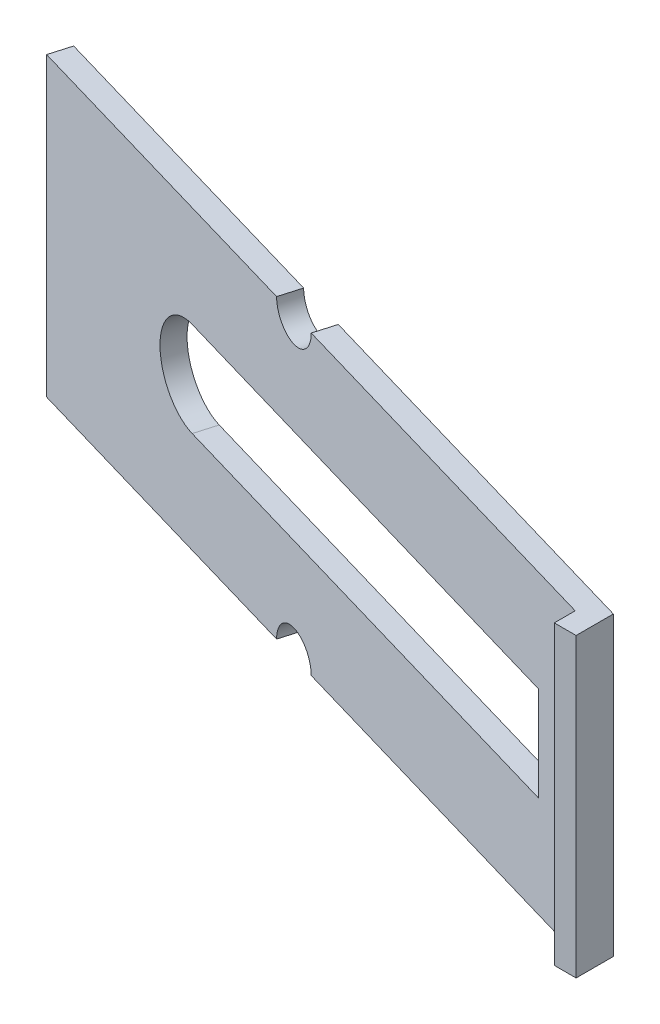
ISO-10303-21;
HEADER;
FILE_DESCRIPTION(('STEP AP214'),'2;1');
FILE_NAME('part.step','',(''),(''),'','','');
FILE_SCHEMA(('AUTOMOTIVE_DESIGN { 1 0 10303 214 1 1 1 1 }'));
ENDSEC;
DATA;
#1=APPLICATION_CONTEXT('core data for automotive mechanical design processes');
#2=APPLICATION_PROTOCOL_DEFINITION('international standard','automotive_design',2000,#1);
#3=PRODUCT_CONTEXT('',#1,'mechanical');
#4=PRODUCT('Part','Part','',(#3));
#5=PRODUCT_RELATED_PRODUCT_CATEGORY('part','',(#4));
#6=PRODUCT_DEFINITION_FORMATION('','',#4);
#7=PRODUCT_DEFINITION_CONTEXT('part definition',#1,'design');
#8=PRODUCT_DEFINITION('design','',#6,#7);
#9=PRODUCT_DEFINITION_SHAPE('','',#8);
#10=(LENGTH_UNIT() NAMED_UNIT(*) SI_UNIT(.MILLI.,.METRE.));
#11=(NAMED_UNIT(*) PLANE_ANGLE_UNIT() SI_UNIT($,.RADIAN.));
#12=(NAMED_UNIT(*) SI_UNIT($,.STERADIAN.) SOLID_ANGLE_UNIT());
#13=UNCERTAINTY_MEASURE_WITH_UNIT(LENGTH_MEASURE(1.E-05),#10,'distance_accuracy_value','');
#14=(GEOMETRIC_REPRESENTATION_CONTEXT(3) GLOBAL_UNCERTAINTY_ASSIGNED_CONTEXT((#13)) GLOBAL_UNIT_ASSIGNED_CONTEXT((#10,
#11,#12)) REPRESENTATION_CONTEXT('',''));
#15=CARTESIAN_POINT('',(0.,0.,0.));
#16=DIRECTION('',(0.,0.,1.));
#17=DIRECTION('',(1.,0.,0.));
#18=AXIS2_PLACEMENT_3D('',#15,#16,#17);
#19=CARTESIAN_POINT('',(0.,4.08,0.));
#20=DIRECTION('',(0.,1.,0.));
#21=DIRECTION('',(0.,0.,1.));
#22=AXIS2_PLACEMENT_3D('',#19,#20,#21);
#23=PLANE('',#22);
#24=DIRECTION('',(0.279829014030986,0.,-0.960049854385931));
#25=VECTOR('',#24,1.);
#26=CARTESIAN_POINT('',(-5.49324690261549,4.08,-1.02970279064248));
#27=LINE('',#26,#25);
#28=CARTESIAN_POINT('',(-5.27424605850798,4.08,-1.78106064831098));
#29=VERTEX_POINT('',#28);
#30=CARTESIAN_POINT('',(-5.19029735429868,4.08,-2.06907560462676));
#31=VERTEX_POINT('',#30);
#32=EDGE_CURVE('E145',#29,#31,#27,.T.);
#33=ORIENTED_EDGE('',*,*,#32,.F.);
#34=DIRECTION('',(0.96004985438593,0.,0.279829014030986));
#35=VECTOR('',#34,1.);
#36=CARTESIAN_POINT('',(-0.15,4.08,-0.287479126837171));
#37=LINE('',#36,#35);
#38=CARTESIAN_POINT('',(-0.15,4.08,-0.287479126837171));
#39=VERTEX_POINT('',#38);
#40=EDGE_CURVE('E174',#29,#39,#37,.T.);
#41=ORIENTED_EDGE('',*,*,#40,.T.);
#42=DIRECTION('',(0.,0.,1.));
#43=VECTOR('',#42,1.);
#44=CARTESIAN_POINT('',(-0.15,4.08,0.));
#45=LINE('',#44,#43);
#46=CARTESIAN_POINT('',(-0.15,4.08,0.));
#47=VERTEX_POINT('',#46);
#48=EDGE_CURVE('E183',#39,#47,#45,.T.);
#49=ORIENTED_EDGE('',*,*,#48,.T.);
#50=DIRECTION('',(1.,0.,0.));
#51=VECTOR('',#50,1.);
#52=CARTESIAN_POINT('',(-0.15,4.08,0.));
#53=LINE('',#52,#51);
#54=CARTESIAN_POINT('',(0.15,4.08,0.));
#55=VERTEX_POINT('',#54);
#56=EDGE_CURVE('E211',#47,#55,#53,.T.);
#57=ORIENTED_EDGE('',*,*,#56,.T.);
#58=DIRECTION('',(0.,0.,-1.));
#59=VECTOR('',#58,1.);
#60=CARTESIAN_POINT('',(0.15,4.08,0.));
#61=LINE('',#60,#59);
#62=CARTESIAN_POINT('',(0.15,4.08,-0.51252087316283));
#63=VERTEX_POINT('',#62);
#64=EDGE_CURVE('E167',#55,#63,#61,.T.);
#65=ORIENTED_EDGE('',*,*,#64,.T.);
#66=DIRECTION('',(-0.96004985438593,0.,-0.279829014030986));
#67=VECTOR('',#66,1.);
#68=CARTESIAN_POINT('',(0.15,4.08,-0.51252087316283));
#69=LINE('',#68,#67);
#70=EDGE_CURVE('E160',#63,#31,#69,.T.);
#71=ORIENTED_EDGE('',*,*,#70,.T.);
#72=EDGE_LOOP('',(#33,#41,#49,#57,#65,#71));
#73=FACE_BOUND('',#72,.T.);
#74=ADVANCED_FACE('F45',(#73),#23,.T.);
#75=CARTESIAN_POINT('',(0.,0.,0.));
#76=DIRECTION('',(0.,1.,0.));
#77=DIRECTION('',(0.,0.,1.));
#78=AXIS2_PLACEMENT_3D('',#75,#76,#77);
#79=PLANE('',#78);
#80=DIRECTION('',(0.96004985438593,0.,0.279829014030986));
#81=VECTOR('',#80,1.);
#82=CARTESIAN_POINT('',(-0.15,0.,-0.287479126837171));
#83=LINE('',#82,#81);
#84=CARTESIAN_POINT('',(-5.27424605850798,0.,-1.78106064831098));
#85=VERTEX_POINT('',#84);
#86=CARTESIAN_POINT('',(-0.15,0.,-0.287479126837171));
#87=VERTEX_POINT('',#86);
#88=EDGE_CURVE('E203',#85,#87,#83,.T.);
#89=ORIENTED_EDGE('',*,*,#88,.F.);
#90=DIRECTION('',(0.279829014030986,0.,-0.960049854385931));
#91=VECTOR('',#90,1.);
#92=CARTESIAN_POINT('',(-5.49324690261549,0.,-1.02970279064248));
#93=LINE('',#92,#91);
#94=CARTESIAN_POINT('',(-5.19029735429868,0.,-2.06907560462676));
#95=VERTEX_POINT('',#94);
#96=EDGE_CURVE('E235',#85,#95,#93,.T.);
#97=ORIENTED_EDGE('',*,*,#96,.T.);
#98=DIRECTION('',(-0.96004985438593,0.,-0.279829014030986));
#99=VECTOR('',#98,1.);
#100=CARTESIAN_POINT('',(0.15,0.,-0.51252087316283));
#101=LINE('',#100,#99);
#102=CARTESIAN_POINT('',(0.15,0.,-0.51252087316283));
#103=VERTEX_POINT('',#102);
#104=EDGE_CURVE('E196',#103,#95,#101,.T.);
#105=ORIENTED_EDGE('',*,*,#104,.F.);
#106=DIRECTION('',(0.,0.,-1.));
#107=VECTOR('',#106,1.);
#108=CARTESIAN_POINT('',(0.15,0.,0.));
#109=LINE('',#108,#107);
#110=CARTESIAN_POINT('',(0.15,0.,0.));
#111=VERTEX_POINT('',#110);
#112=EDGE_CURVE('E191',#111,#103,#109,.T.);
#113=ORIENTED_EDGE('',*,*,#112,.F.);
#114=DIRECTION('',(1.,0.,0.));
#115=VECTOR('',#114,1.);
#116=CARTESIAN_POINT('',(-0.15,0.,0.));
#117=LINE('',#116,#115);
#118=CARTESIAN_POINT('',(-0.15,0.,0.));
#119=VERTEX_POINT('',#118);
#120=EDGE_CURVE('E187',#119,#111,#117,.T.);
#121=ORIENTED_EDGE('',*,*,#120,.F.);
#122=DIRECTION('',(0.,0.,1.));
#123=VECTOR('',#122,1.);
#124=CARTESIAN_POINT('',(-0.15,0.,0.));
#125=LINE('',#124,#123);
#126=EDGE_CURVE('E208',#87,#119,#125,.T.);
#127=ORIENTED_EDGE('',*,*,#126,.F.);
#128=EDGE_LOOP('',(#89,#97,#105,#113,#121,#127));
#129=FACE_BOUND('',#128,.T.);
#130=ADVANCED_FACE('F233',(#129),#79,.F.);
#131=CARTESIAN_POINT('',(-0.15,4.08,0.));
#132=DIRECTION('',(0.,0.,-1.));
#133=DIRECTION('',(-1.,0.,0.));
#134=AXIS2_PLACEMENT_3D('',#131,#132,#133);
#135=PLANE('',#134);
#136=ORIENTED_EDGE('',*,*,#120,.T.);
#137=DIRECTION('',(0.,-1.,0.));
#138=VECTOR('',#137,1.);
#139=CARTESIAN_POINT('',(0.15,4.08,0.));
#140=LINE('',#139,#138);
#141=EDGE_CURVE('E11',#55,#111,#140,.T.);
#142=ORIENTED_EDGE('',*,*,#141,.F.);
#143=ORIENTED_EDGE('',*,*,#56,.F.);
#144=DIRECTION('',(0.,-1.,0.));
#145=VECTOR('',#144,1.);
#146=CARTESIAN_POINT('',(-0.15,4.08,0.));
#147=LINE('',#146,#145);
#148=EDGE_CURVE('E186',#47,#119,#147,.T.);
#149=ORIENTED_EDGE('',*,*,#148,.T.);
#150=EDGE_LOOP('',(#136,#142,#143,#149));
#151=FACE_BOUND('',#150,.T.);
#152=ADVANCED_FACE('F47',(#151),#135,.F.);
#153=CARTESIAN_POINT('',(0.15,4.08,0.));
#154=DIRECTION('',(-1.,0.,0.));
#155=DIRECTION('',(0.,0.,1.));
#156=AXIS2_PLACEMENT_3D('',#153,#154,#155);
#157=PLANE('',#156);
#158=ORIENTED_EDGE('',*,*,#112,.T.);
#159=DIRECTION('',(0.,-1.,0.));
#160=VECTOR('',#159,1.);
#161=CARTESIAN_POINT('',(0.15,4.08,-0.51252087316283));
#162=LINE('',#161,#160);
#163=EDGE_CURVE('E54',#63,#103,#162,.T.);
#164=ORIENTED_EDGE('',*,*,#163,.F.);
#165=ORIENTED_EDGE('',*,*,#64,.F.);
#166=ORIENTED_EDGE('',*,*,#141,.T.);
#167=EDGE_LOOP('',(#158,#164,#165,#166));
#168=FACE_BOUND('',#167,.T.);
#169=ADVANCED_FACE('F294',(#168),#157,.F.);
#170=CARTESIAN_POINT('',(0.15,4.08,-0.51252087316283));
#171=DIRECTION('',(-0.279829014030986,0.,0.96004985438593));
#172=DIRECTION('',(0.960049854385931,0.,0.279829014030986));
#173=AXIS2_PLACEMENT_3D('',#170,#171,#172);
#174=PLANE('',#173);
#175=DIRECTION('',(-0.96004985438593,0.,-0.279829014030986));
#176=VECTOR('',#175,1.);
#177=CARTESIAN_POINT('',(-0.781248358754352,1.39,-0.783955016772886));
#178=LINE('',#177,#176);
#179=CARTESIAN_POINT('',(-0.781248358754352,1.39,-0.783955016772886));
#180=VERTEX_POINT('',#179);
#181=CARTESIAN_POINT('',(-7.50159733945587,1.39,-2.74275811498979));
#182=VERTEX_POINT('',#181);
#183=EDGE_CURVE('E262',#180,#182,#178,.T.);
#184=ORIENTED_EDGE('',*,*,#183,.F.);
#185=DIRECTION('',(0.,-1.,0.));
#186=VECTOR('',#185,1.);
#187=CARTESIAN_POINT('',(-0.781248358754352,2.69,-0.783955016772886));
#188=LINE('',#187,#186);
#189=CARTESIAN_POINT('',(-0.781248358754352,2.69,-0.783955016772886));
#190=VERTEX_POINT('',#189);
#191=EDGE_CURVE('E259',#190,#180,#188,.T.);
#192=ORIENTED_EDGE('',*,*,#191,.F.);
#193=DIRECTION('',(0.96004985438593,0.,0.279829014030986));
#194=VECTOR('',#193,1.);
#195=CARTESIAN_POINT('',(-0.781248358754352,2.69,-0.783955016772886));
#196=LINE('',#195,#194);
#197=CARTESIAN_POINT('',(-7.50159733945587,2.69,-2.74275811498979));
#198=VERTEX_POINT('',#197);
#199=EDGE_CURVE('E270',#198,#190,#196,.T.);
#200=ORIENTED_EDGE('',*,*,#199,.F.);
#201=CARTESIAN_POINT('',(-7.50159733945587,2.04,-2.74275811498979));
#202=DIRECTION('',(0.279829014030986,0.,-0.960049854385931));
#203=DIRECTION('',(0.96004985438593,0.,0.279829014030986));
#204=AXIS2_PLACEMENT_3D('',#201,#202,#203);
#205=CIRCLE('',#204,0.65);
#206=EDGE_CURVE('E266',#182,#198,#205,.T.);
#207=ORIENTED_EDGE('',*,*,#206,.F.);
#208=EDGE_LOOP('',(#184,#192,#200,#207));
#209=FACE_BOUND('',#208,.T.);
#210=CARTESIAN_POINT('',(-5.86233225236883,4.08,-2.26495591444845));
#211=VERTEX_POINT('',#210);
#212=CARTESIAN_POINT('',(-10.3265640752634,4.08,-3.56616082969254));
#213=VERTEX_POINT('',#212);
#214=EDGE_CURVE('E162',#211,#213,#69,.T.);
#215=ORIENTED_EDGE('',*,*,#214,.F.);
#216=CARTESIAN_POINT('',(-5.52631480333376,4.08,-2.16701575953761));
#217=DIRECTION('',(0.279829014030986,0.,-0.960049854385931));
#218=DIRECTION('',(0.96004985438593,0.,0.279829014030986));
#219=AXIS2_PLACEMENT_3D('',#216,#217,#218);
#220=CIRCLE('',#219,0.35);
#221=EDGE_CURVE('E61',#31,#211,#220,.T.);
#222=ORIENTED_EDGE('',*,*,#221,.F.);
#223=ORIENTED_EDGE('',*,*,#70,.F.);
#224=ORIENTED_EDGE('',*,*,#163,.T.);
#225=ORIENTED_EDGE('',*,*,#104,.T.);
#226=CARTESIAN_POINT('',(-5.52631480333376,0.,-2.16701575953761));
#227=DIRECTION('',(0.279829014030986,0.,-0.960049854385931));
#228=DIRECTION('',(-0.96004985438593,0.,-0.279829014030986));
#229=AXIS2_PLACEMENT_3D('',#226,#227,#228);
#230=CIRCLE('',#229,0.35);
#231=CARTESIAN_POINT('',(-5.86233225236883,0.,-2.26495591444845));
#232=VERTEX_POINT('',#231);
#233=EDGE_CURVE('E164',#232,#95,#230,.T.);
#234=ORIENTED_EDGE('',*,*,#233,.F.);
#235=CARTESIAN_POINT('',(-10.3265640752634,0.,-3.56616082969254));
#236=VERTEX_POINT('',#235);
#237=EDGE_CURVE('E195',#232,#236,#101,.T.);
#238=ORIENTED_EDGE('',*,*,#237,.T.);
#239=DIRECTION('',(0.,-1.,0.));
#240=VECTOR('',#239,1.);
#241=CARTESIAN_POINT('',(-10.3265640752634,4.08,-3.56616082969254));
#242=LINE('',#241,#240);
#243=EDGE_CURVE('E223',#213,#236,#242,.T.);
#244=ORIENTED_EDGE('',*,*,#243,.F.);
#245=EDGE_LOOP('',(#215,#222,#223,#224,#225,#234,#238,#244));
#246=FACE_BOUND('',#245,.T.);
#247=ADVANCED_FACE('F158',(#209,#246),#174,.F.);
#248=CARTESIAN_POINT('',(-10.4105127794727,4.08,-3.27814587337676));
#249=DIRECTION('',(0.960049854385931,0.,0.279829014030985));
#250=DIRECTION('',(0.279829014030985,0.,-0.960049854385931));
#251=AXIS2_PLACEMENT_3D('',#248,#249,#250);
#252=PLANE('',#251);
#253=DIRECTION('',(-0.279829014030985,0.,0.960049854385931));
#254=VECTOR('',#253,1.);
#255=CARTESIAN_POINT('',(-10.4105127794727,0.,-3.27814587337676));
#256=LINE('',#255,#254);
#257=CARTESIAN_POINT('',(-10.4105127794727,0.,-3.27814587337676));
#258=VERTEX_POINT('',#257);
#259=EDGE_CURVE('E200',#236,#258,#256,.T.);
#260=ORIENTED_EDGE('',*,*,#259,.T.);
#261=DIRECTION('',(0.,-1.,0.));
#262=VECTOR('',#261,1.);
#263=CARTESIAN_POINT('',(-10.4105127794727,4.08,-3.27814587337676));
#264=LINE('',#263,#262);
#265=CARTESIAN_POINT('',(-10.4105127794727,4.08,-3.27814587337676));
#266=VERTEX_POINT('',#265);
#267=EDGE_CURVE('E219',#266,#258,#264,.T.);
#268=ORIENTED_EDGE('',*,*,#267,.F.);
#269=DIRECTION('',(-0.279829014030985,0.,0.960049854385931));
#270=VECTOR('',#269,1.);
#271=CARTESIAN_POINT('',(-10.4105127794727,4.08,-3.27814587337676));
#272=LINE('',#271,#270);
#273=EDGE_CURVE('E170',#213,#266,#272,.T.);
#274=ORIENTED_EDGE('',*,*,#273,.F.);
#275=ORIENTED_EDGE('',*,*,#243,.T.);
#276=EDGE_LOOP('',(#260,#268,#274,#275));
#277=FACE_BOUND('',#276,.T.);
#278=ADVANCED_FACE('F301',(#277),#252,.F.);
#279=CARTESIAN_POINT('',(-0.15,4.08,-0.287479126837171));
#280=DIRECTION('',(0.279829014030986,0.,-0.960049854385931));
#281=DIRECTION('',(-0.960049854385931,0.,-0.279829014030986));
#282=AXIS2_PLACEMENT_3D('',#279,#280,#281);
#283=PLANE('',#282);
#284=DIRECTION('',(-0.960049854385931,0.,-0.279829014030986));
#285=VECTOR('',#284,1.);
#286=CARTESIAN_POINT('',(-0.865197062963648,2.69,-0.495940060457107));
#287=LINE('',#286,#285);
#288=CARTESIAN_POINT('',(-0.865197062963647,2.69,-0.495940060457107));
#289=VERTEX_POINT('',#288);
#290=CARTESIAN_POINT('',(-7.58554604366516,2.69,-2.45474315867401));
#291=VERTEX_POINT('',#290);
#292=EDGE_CURVE('E252',#289,#291,#287,.T.);
#293=ORIENTED_EDGE('',*,*,#292,.F.);
#294=DIRECTION('',(0.,1.,0.));
#295=VECTOR('',#294,1.);
#296=CARTESIAN_POINT('',(-0.865197062963648,2.69,-0.495940060457107));
#297=LINE('',#296,#295);
#298=CARTESIAN_POINT('',(-0.865197062963647,1.39,-0.495940060457107));
#299=VERTEX_POINT('',#298);
#300=EDGE_CURVE('E256',#299,#289,#297,.T.);
#301=ORIENTED_EDGE('',*,*,#300,.F.);
#302=DIRECTION('',(0.960049854385931,0.,0.279829014030986));
#303=VECTOR('',#302,1.);
#304=CARTESIAN_POINT('',(-0.865197062963648,1.39,-0.495940060457107));
#305=LINE('',#304,#303);
#306=CARTESIAN_POINT('',(-7.58554604366516,1.39,-2.45474315867401));
#307=VERTEX_POINT('',#306);
#308=EDGE_CURVE('E192',#307,#299,#305,.T.);
#309=ORIENTED_EDGE('',*,*,#308,.F.);
#310=CARTESIAN_POINT('',(-7.58554604366516,2.04,-2.45474315867401));
#311=DIRECTION('',(0.279829014030986,0.,-0.960049854385931));
#312=DIRECTION('',(-0.960049854385931,0.,-0.279829014030986));
#313=AXIS2_PLACEMENT_3D('',#310,#311,#312);
#314=CIRCLE('',#313,0.65);
#315=EDGE_CURVE('E248',#291,#307,#314,.F.);
#316=ORIENTED_EDGE('',*,*,#315,.F.);
#317=EDGE_LOOP('',(#293,#301,#309,#316));
#318=FACE_BOUND('',#317,.T.);
#319=ORIENTED_EDGE('',*,*,#40,.F.);
#320=CARTESIAN_POINT('',(-5.61026350754305,4.08,-1.87900080322183));
#321=DIRECTION('',(0.279829014030986,0.,-0.960049854385931));
#322=DIRECTION('',(-0.960049854385931,0.,-0.279829014030986));
#323=AXIS2_PLACEMENT_3D('',#320,#321,#322);
#324=CIRCLE('',#323,0.35);
#325=CARTESIAN_POINT('',(-5.94628095657813,4.08,-1.97694095813267));
#326=VERTEX_POINT('',#325);
#327=EDGE_CURVE('E148',#326,#29,#324,.F.);
#328=ORIENTED_EDGE('',*,*,#327,.F.);
#329=EDGE_CURVE('E179',#266,#326,#37,.T.);
#330=ORIENTED_EDGE('',*,*,#329,.F.);
#331=ORIENTED_EDGE('',*,*,#267,.T.);
#332=CARTESIAN_POINT('',(-5.94628095657813,0.,-1.97694095813267));
#333=VERTEX_POINT('',#332);
#334=EDGE_CURVE('E204',#258,#333,#83,.T.);
#335=ORIENTED_EDGE('',*,*,#334,.T.);
#336=CARTESIAN_POINT('',(-5.61026350754305,0.,-1.87900080322183));
#337=DIRECTION('',(0.279829014030986,0.,-0.960049854385931));
#338=DIRECTION('',(-0.960049854385931,0.,-0.279829014030986));
#339=AXIS2_PLACEMENT_3D('',#336,#337,#338);
#340=CIRCLE('',#339,0.35);
#341=EDGE_CURVE('E69',#85,#333,#340,.F.);
#342=ORIENTED_EDGE('',*,*,#341,.F.);
#343=ORIENTED_EDGE('',*,*,#88,.T.);
#344=DIRECTION('',(0.,-1.,0.));
#345=VECTOR('',#344,1.);
#346=CARTESIAN_POINT('',(-0.15,4.08,-0.287479126837171));
#347=LINE('',#346,#345);
#348=EDGE_CURVE('E215',#39,#87,#347,.T.);
#349=ORIENTED_EDGE('',*,*,#348,.F.);
#350=EDGE_LOOP('',(#319,#328,#330,#331,#335,#342,#343,#349));
#351=FACE_BOUND('',#350,.T.);
#352=ADVANCED_FACE('F324',(#318,#351),#283,.F.);
#353=CARTESIAN_POINT('',(-0.15,4.08,0.));
#354=DIRECTION('',(1.,0.,0.));
#355=DIRECTION('',(0.,0.,-1.));
#356=AXIS2_PLACEMENT_3D('',#353,#354,#355);
#357=PLANE('',#356);
#358=ORIENTED_EDGE('',*,*,#126,.T.);
#359=ORIENTED_EDGE('',*,*,#148,.F.);
#360=ORIENTED_EDGE('',*,*,#48,.F.);
#361=ORIENTED_EDGE('',*,*,#348,.T.);
#362=EDGE_LOOP('',(#358,#359,#360,#361));
#363=FACE_BOUND('',#362,.T.);
#364=ADVANCED_FACE('F315',(#363),#357,.F.);
#365=DIRECTION('',(0.279829014030986,0.,-0.960049854385931));
#366=VECTOR('',#365,1.);
#367=CARTESIAN_POINT('',(-6.16528180068564,4.08,-1.22558310046417));
#368=LINE('',#367,#366);
#369=EDGE_CURVE('E153',#326,#211,#368,.T.);
#370=ORIENTED_EDGE('',*,*,#369,.T.);
#371=ORIENTED_EDGE('',*,*,#214,.T.);
#372=ORIENTED_EDGE('',*,*,#273,.T.);
#373=ORIENTED_EDGE('',*,*,#329,.T.);
#374=EDGE_LOOP('',(#370,#371,#372,#373));
#375=FACE_BOUND('',#374,.T.);
#376=ADVANCED_FACE('F306',(#375),#23,.T.);
#377=ORIENTED_EDGE('',*,*,#237,.F.);
#378=DIRECTION('',(0.279829014030986,0.,-0.960049854385931));
#379=VECTOR('',#378,1.);
#380=CARTESIAN_POINT('',(-6.16528180068564,0.,-1.22558310046417));
#381=LINE('',#380,#379);
#382=EDGE_CURVE('E238',#333,#232,#381,.T.);
#383=ORIENTED_EDGE('',*,*,#382,.F.);
#384=ORIENTED_EDGE('',*,*,#334,.F.);
#385=ORIENTED_EDGE('',*,*,#259,.F.);
#386=EDGE_LOOP('',(#377,#383,#384,#385));
#387=FACE_BOUND('',#386,.T.);
#388=ADVANCED_FACE('F312',(#387),#79,.F.);
#389=CARTESIAN_POINT('',(-3.03657825577517,2.69,6.95373132259761));
#390=DIRECTION('',(0.96004985438593,0.,0.279829014030986));
#391=DIRECTION('',(0.279829014030986,0.,-0.960049854385931));
#392=AXIS2_PLACEMENT_3D('',#389,#390,#391);
#393=PLANE('',#392);
#394=ORIENTED_EDGE('',*,*,#300,.T.);
#395=DIRECTION('',(0.279829014030986,0.,-0.96004985438593));
#396=VECTOR('',#395,1.);
#397=CARTESIAN_POINT('',(-3.03657825577517,2.69,6.95373132259761));
#398=LINE('',#397,#396);
#399=EDGE_CURVE('E253',#289,#190,#398,.T.);
#400=ORIENTED_EDGE('',*,*,#399,.T.);
#401=ORIENTED_EDGE('',*,*,#191,.T.);
#402=DIRECTION('',(0.279829014030986,0.,-0.96004985438593));
#403=VECTOR('',#402,1.);
#404=CARTESIAN_POINT('',(-3.03657825577517,1.39,6.95373132259761));
#405=LINE('',#404,#403);
#406=EDGE_CURVE('E274',#299,#180,#405,.T.);
#407=ORIENTED_EDGE('',*,*,#406,.F.);
#408=EDGE_LOOP('',(#394,#400,#401,#407));
#409=FACE_BOUND('',#408,.T.);
#410=ADVANCED_FACE('F321',(#409),#393,.F.);
#411=CARTESIAN_POINT('',(-3.03657825577517,2.69,6.95373132259761));
#412=DIRECTION('',(0.,1.,0.));
#413=DIRECTION('',(0.,0.,1.));
#414=AXIS2_PLACEMENT_3D('',#411,#412,#413);
#415=PLANE('',#414);
#416=ORIENTED_EDGE('',*,*,#292,.T.);
#417=DIRECTION('',(0.279829014030986,0.,-0.96004985438593));
#418=VECTOR('',#417,1.);
#419=CARTESIAN_POINT('',(-9.75692723647669,2.69,4.99492822438071));
#420=LINE('',#419,#418);
#421=EDGE_CURVE('E277',#291,#198,#420,.T.);
#422=ORIENTED_EDGE('',*,*,#421,.T.);
#423=ORIENTED_EDGE('',*,*,#199,.T.);
#424=ORIENTED_EDGE('',*,*,#399,.F.);
#425=EDGE_LOOP('',(#416,#422,#423,#424));
#426=FACE_BOUND('',#425,.T.);
#427=ADVANCED_FACE('F357',(#426),#415,.F.);
#428=CARTESIAN_POINT('',(-9.75692723647669,2.04,4.99492822438071));
#429=DIRECTION('',(0.279829014030986,0.,-0.96004985438593));
#430=DIRECTION('',(-0.960049854385931,0.,-0.279829014030986));
#431=AXIS2_PLACEMENT_3D('',#428,#429,#430);
#432=CYLINDRICAL_SURFACE('',#431,0.65);
#433=ORIENTED_EDGE('',*,*,#315,.T.);
#434=DIRECTION('',(0.279829014030986,0.,-0.96004985438593));
#435=VECTOR('',#434,1.);
#436=CARTESIAN_POINT('',(-9.75692723647669,1.39,4.99492822438071));
#437=LINE('',#436,#435);
#438=EDGE_CURVE('E280',#307,#182,#437,.T.);
#439=ORIENTED_EDGE('',*,*,#438,.T.);
#440=ORIENTED_EDGE('',*,*,#206,.T.);
#441=ORIENTED_EDGE('',*,*,#421,.F.);
#442=EDGE_LOOP('',(#433,#439,#440,#441));
#443=FACE_BOUND('',#442,.T.);
#444=ADVANCED_FACE('F359',(#443),#432,.F.);
#445=CARTESIAN_POINT('',(-3.03657825577517,1.39,6.95373132259761));
#446=DIRECTION('',(0.,-1.,0.));
#447=DIRECTION('',(0.,0.,-1.));
#448=AXIS2_PLACEMENT_3D('',#445,#446,#447);
#449=PLANE('',#448);
#450=ORIENTED_EDGE('',*,*,#308,.T.);
#451=ORIENTED_EDGE('',*,*,#406,.T.);
#452=ORIENTED_EDGE('',*,*,#183,.T.);
#453=ORIENTED_EDGE('',*,*,#438,.F.);
#454=EDGE_LOOP('',(#450,#451,#452,#453));
#455=FACE_BOUND('',#454,.T.);
#456=ADVANCED_FACE('F367',(#455),#449,.F.);
#457=CARTESIAN_POINT('',(-5.82926435165056,0.,-1.12764294555333));
#458=DIRECTION('',(0.279829014030986,0.,-0.960049854385931));
#459=DIRECTION('',(-0.960049854385931,0.,-0.279829014030986));
#460=AXIS2_PLACEMENT_3D('',#457,#458,#459);
#461=CYLINDRICAL_SURFACE('',#460,0.35);
#462=ORIENTED_EDGE('',*,*,#341,.T.);
#463=ORIENTED_EDGE('',*,*,#382,.T.);
#464=ORIENTED_EDGE('',*,*,#233,.T.);
#465=ORIENTED_EDGE('',*,*,#96,.F.);
#466=EDGE_LOOP('',(#462,#463,#464,#465));
#467=FACE_BOUND('',#466,.T.);
#468=ADVANCED_FACE('F339',(#467),#461,.F.);
#469=CARTESIAN_POINT('',(-5.82926435165056,4.08,-1.12764294555333));
#470=DIRECTION('',(0.279829014030986,0.,-0.960049854385931));
#471=DIRECTION('',(-0.960049854385931,0.,-0.279829014030986));
#472=AXIS2_PLACEMENT_3D('',#469,#470,#471);
#473=CYLINDRICAL_SURFACE('',#472,0.35);
#474=ORIENTED_EDGE('',*,*,#327,.T.);
#475=ORIENTED_EDGE('',*,*,#32,.T.);
#476=ORIENTED_EDGE('',*,*,#221,.T.);
#477=ORIENTED_EDGE('',*,*,#369,.F.);
#478=EDGE_LOOP('',(#474,#475,#476,#477));
#479=FACE_BOUND('',#478,.T.);
#480=ADVANCED_FACE('F146',(#479),#473,.F.);
#481=CLOSED_SHELL('',(#74,#130,#152,#169,#247,#278,#352,#364,#376,#388,#410,#427,#444,#456,#468,#480));
#482=MANIFOLD_SOLID_BREP('B2',#481);
#483=ADVANCED_BREP_SHAPE_REPRESENTATION('',(#18,#482),#14);
#484=SHAPE_DEFINITION_REPRESENTATION(#9,#483);
ENDSEC;
END-ISO-10303-21;
